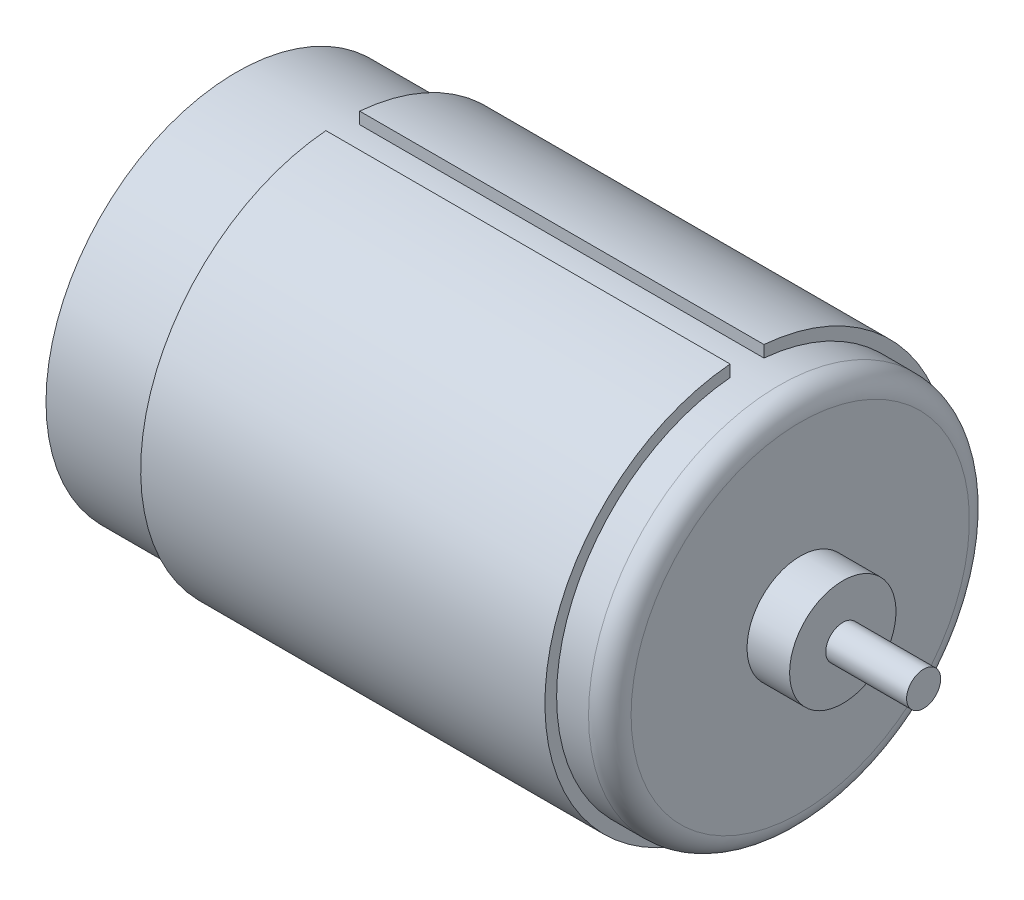
ISO-10303-21;
HEADER;
FILE_DESCRIPTION(('STEP AP214'),'2;1');
FILE_NAME('part.step','',(''),(''),'','','');
FILE_SCHEMA(('AUTOMOTIVE_DESIGN { 1 0 10303 214 1 1 1 1 }'));
ENDSEC;
DATA;
#1=APPLICATION_CONTEXT('core data for automotive mechanical design processes');
#2=APPLICATION_PROTOCOL_DEFINITION('international standard','automotive_design',2000,#1);
#3=PRODUCT_CONTEXT('',#1,'mechanical');
#4=PRODUCT('Part','Part','',(#3));
#5=PRODUCT_RELATED_PRODUCT_CATEGORY('part','',(#4));
#6=PRODUCT_DEFINITION_FORMATION('','',#4);
#7=PRODUCT_DEFINITION_CONTEXT('part definition',#1,'design');
#8=PRODUCT_DEFINITION('design','',#6,#7);
#9=PRODUCT_DEFINITION_SHAPE('','',#8);
#10=(LENGTH_UNIT() NAMED_UNIT(*) SI_UNIT(.MILLI.,.METRE.));
#11=(NAMED_UNIT(*) PLANE_ANGLE_UNIT() SI_UNIT($,.RADIAN.));
#12=(NAMED_UNIT(*) SI_UNIT($,.STERADIAN.) SOLID_ANGLE_UNIT());
#13=UNCERTAINTY_MEASURE_WITH_UNIT(LENGTH_MEASURE(1.E-05),#10,'distance_accuracy_value','');
#14=(GEOMETRIC_REPRESENTATION_CONTEXT(3) GLOBAL_UNCERTAINTY_ASSIGNED_CONTEXT((#13)) GLOBAL_UNIT_ASSIGNED_CONTEXT((#10,
#11,#12)) REPRESENTATION_CONTEXT('',''));
#15=CARTESIAN_POINT('',(0.,0.,0.));
#16=DIRECTION('',(0.,0.,1.));
#17=DIRECTION('',(1.,0.,0.));
#18=AXIS2_PLACEMENT_3D('',#15,#16,#17);
#19=CARTESIAN_POINT('',(0.,0.,0.));
#20=DIRECTION('',(1.,0.,0.));
#21=DIRECTION('',(0.,0.,-1.));
#22=AXIS2_PLACEMENT_3D('',#19,#20,#21);
#23=PLANE('',#22);
#24=CARTESIAN_POINT('',(0.,0.,0.));
#25=DIRECTION('',(-1.,0.,0.));
#26=DIRECTION('',(0.,0.,1.));
#27=AXIS2_PLACEMENT_3D('',#24,#25,#26);
#28=CIRCLE('',#27,17.9);
#29=CARTESIAN_POINT('',(0.,0.,17.9));
#30=VERTEX_POINT('',#29);
#31=EDGE_CURVE('E11',#30,#30,#28,.T.);
#32=ORIENTED_EDGE('',*,*,#31,.T.);
#33=EDGE_LOOP('',(#32));
#34=FACE_BOUND('',#33,.T.);
#35=ADVANCED_FACE('F38',(#34),#23,.F.);
#36=CARTESIAN_POINT('',(10.,17.9,0.));
#37=DIRECTION('',(1.,0.,0.));
#38=DIRECTION('',(0.,0.,-1.));
#39=AXIS2_PLACEMENT_3D('',#36,#37,#38);
#40=PLANE('',#39);
#41=CARTESIAN_POINT('',(10.,0.,0.));
#42=DIRECTION('',(-1.,0.,0.));
#43=DIRECTION('',(0.,0.,1.));
#44=AXIS2_PLACEMENT_3D('',#41,#42,#43);
#45=CIRCLE('',#44,17.9);
#46=CARTESIAN_POINT('',(10.,17.829465604723,-1.5875));
#47=VERTEX_POINT('',#46);
#48=CARTESIAN_POINT('',(10.,17.829465604723,1.5875));
#49=VERTEX_POINT('',#48);
#50=EDGE_CURVE('E46',#47,#49,#45,.T.);
#51=ORIENTED_EDGE('',*,*,#50,.F.);
#52=DIRECTION('',(0.,-1.,0.));
#53=VECTOR('',#52,1.);
#54=CARTESIAN_POINT('',(10.,18.9335639473925,-1.5875));
#55=LINE('',#54,#53);
#56=CARTESIAN_POINT('',(10.,18.9335639473925,-1.5875));
#57=VERTEX_POINT('',#56);
#58=EDGE_CURVE('E86',#57,#47,#55,.T.);
#59=ORIENTED_EDGE('',*,*,#58,.F.);
#60=CARTESIAN_POINT('',(10.,0.,0.));
#61=DIRECTION('',(-1.,0.,0.));
#62=DIRECTION('',(0.,0.,1.));
#63=AXIS2_PLACEMENT_3D('',#60,#61,#62);
#64=CIRCLE('',#63,19.);
#65=CARTESIAN_POINT('',(10.,18.9335639473925,1.5875));
#66=VERTEX_POINT('',#65);
#67=EDGE_CURVE('E94',#57,#66,#64,.T.);
#68=ORIENTED_EDGE('',*,*,#67,.T.);
#69=DIRECTION('',(0.,1.,0.));
#70=VECTOR('',#69,1.);
#71=CARTESIAN_POINT('',(10.,18.9335639473925,1.5875));
#72=LINE('',#71,#70);
#73=EDGE_CURVE('E79',#49,#66,#72,.T.);
#74=ORIENTED_EDGE('',*,*,#73,.F.);
#75=EDGE_LOOP('',(#51,#59,#68,#74));
#76=FACE_BOUND('',#75,.T.);
#77=ADVANCED_FACE('F91',(#76),#40,.F.);
#78=CARTESIAN_POINT('',(0.,0.,0.));
#79=DIRECTION('',(-1.,0.,0.));
#80=DIRECTION('',(0.,0.,1.));
#81=AXIS2_PLACEMENT_3D('',#78,#79,#80);
#82=CYLINDRICAL_SURFACE('',#81,19.);
#83=ORIENTED_EDGE('',*,*,#67,.F.);
#84=DIRECTION('',(-1.,0.,0.));
#85=VECTOR('',#84,1.);
#86=CARTESIAN_POINT('',(64.601,18.9335639473925,-1.5875));
#87=LINE('',#86,#85);
#88=CARTESIAN_POINT('',(48.,18.9335639473925,-1.5875));
#89=VERTEX_POINT('',#88);
#90=EDGE_CURVE('E132',#89,#57,#87,.T.);
#91=ORIENTED_EDGE('',*,*,#90,.F.);
#92=CARTESIAN_POINT('',(48.,0.,0.));
#93=DIRECTION('',(-1.,0.,0.));
#94=DIRECTION('',(0.,0.,1.));
#95=AXIS2_PLACEMENT_3D('',#92,#93,#94);
#96=CIRCLE('',#95,19.);
#97=CARTESIAN_POINT('',(48.,18.9335639473925,1.5875));
#98=VERTEX_POINT('',#97);
#99=EDGE_CURVE('E99',#89,#98,#96,.T.);
#100=ORIENTED_EDGE('',*,*,#99,.T.);
#101=DIRECTION('',(-1.,0.,0.));
#102=VECTOR('',#101,1.);
#103=CARTESIAN_POINT('',(64.601,18.9335639473925,1.5875));
#104=LINE('',#103,#102);
#105=EDGE_CURVE('E85',#98,#66,#104,.T.);
#106=ORIENTED_EDGE('',*,*,#105,.T.);
#107=EDGE_LOOP('',(#83,#91,#100,#106));
#108=FACE_BOUND('',#107,.T.);
#109=ADVANCED_FACE('F141',(#108),#82,.T.);
#110=CARTESIAN_POINT('',(48.,19.,0.));
#111=DIRECTION('',(-1.,0.,0.));
#112=DIRECTION('',(0.,0.,1.));
#113=AXIS2_PLACEMENT_3D('',#110,#111,#112);
#114=PLANE('',#113);
#115=ORIENTED_EDGE('',*,*,#99,.F.);
#116=DIRECTION('',(0.,1.,0.));
#117=VECTOR('',#116,1.);
#118=CARTESIAN_POINT('',(48.,18.9335639473925,-1.5875));
#119=LINE('',#118,#117);
#120=CARTESIAN_POINT('',(48.,17.829465604723,-1.5875));
#121=VERTEX_POINT('',#120);
#122=EDGE_CURVE('E95',#121,#89,#119,.T.);
#123=ORIENTED_EDGE('',*,*,#122,.F.);
#124=CARTESIAN_POINT('',(48.,0.,0.));
#125=DIRECTION('',(-1.,0.,0.));
#126=DIRECTION('',(0.,0.,1.));
#127=AXIS2_PLACEMENT_3D('',#124,#125,#126);
#128=CIRCLE('',#127,17.9);
#129=CARTESIAN_POINT('',(48.,17.829465604723,1.5875));
#130=VERTEX_POINT('',#129);
#131=EDGE_CURVE('E104',#121,#130,#128,.T.);
#132=ORIENTED_EDGE('',*,*,#131,.T.);
#133=DIRECTION('',(0.,-1.,0.));
#134=VECTOR('',#133,1.);
#135=CARTESIAN_POINT('',(48.,18.9335639473925,1.5875));
#136=LINE('',#135,#134);
#137=EDGE_CURVE('E53',#98,#130,#136,.T.);
#138=ORIENTED_EDGE('',*,*,#137,.F.);
#139=EDGE_LOOP('',(#115,#123,#132,#138));
#140=FACE_BOUND('',#139,.T.);
#141=ADVANCED_FACE('F142',(#140),#114,.F.);
#142=CARTESIAN_POINT('',(0.,0.,0.));
#143=DIRECTION('',(-1.,0.,0.));
#144=DIRECTION('',(0.,0.,1.));
#145=AXIS2_PLACEMENT_3D('',#142,#143,#144);
#146=CYLINDRICAL_SURFACE('',#145,17.9);
#147=ORIENTED_EDGE('',*,*,#131,.F.);
#148=DIRECTION('',(-1.,0.,0.));
#149=VECTOR('',#148,1.);
#150=CARTESIAN_POINT('',(64.601,17.829465604723,-1.5875));
#151=LINE('',#150,#149);
#152=EDGE_CURVE('E61',#121,#47,#151,.T.);
#153=ORIENTED_EDGE('',*,*,#152,.T.);
#154=ORIENTED_EDGE('',*,*,#50,.T.);
#155=DIRECTION('',(-1.,0.,0.));
#156=VECTOR('',#155,1.);
#157=CARTESIAN_POINT('',(64.601,17.829465604723,1.5875));
#158=LINE('',#157,#156);
#159=EDGE_CURVE('E76',#130,#49,#158,.T.);
#160=ORIENTED_EDGE('',*,*,#159,.F.);
#161=EDGE_LOOP('',(#147,#153,#154,#160));
#162=FACE_BOUND('',#161,.T.);
#163=CARTESIAN_POINT('',(51.,0.,0.));
#164=DIRECTION('',(-1.,0.,0.));
#165=DIRECTION('',(0.,0.,1.));
#166=AXIS2_PLACEMENT_3D('',#163,#164,#165);
#167=CIRCLE('',#166,17.9);
#168=CARTESIAN_POINT('',(51.,0.,17.9));
#169=VERTEX_POINT('',#168);
#170=EDGE_CURVE('E106',#169,#169,#167,.T.);
#171=ORIENTED_EDGE('',*,*,#170,.T.);
#172=EDGE_LOOP('',(#171));
#173=FACE_BOUND('',#172,.T.);
#174=ORIENTED_EDGE('',*,*,#31,.F.);
#175=EDGE_LOOP('',(#174));
#176=FACE_BOUND('',#175,.T.);
#177=ADVANCED_FACE('F97',(#162,#173,#176),#146,.T.);
#178=CARTESIAN_POINT('',(51.,0.,0.));
#179=DIRECTION('',(-1.,0.,0.));
#180=DIRECTION('',(0.,0.,1.));
#181=AXIS2_PLACEMENT_3D('',#178,#179,#180);
#182=TOROIDAL_SURFACE('',#181,15.9,2.);
#183=ORIENTED_EDGE('',*,*,#170,.F.);
#184=EDGE_LOOP('',(#183));
#185=FACE_BOUND('',#184,.T.);
#186=CARTESIAN_POINT('',(53.,0.,0.));
#187=DIRECTION('',(-1.,0.,0.));
#188=DIRECTION('',(0.,0.,1.));
#189=AXIS2_PLACEMENT_3D('',#186,#187,#188);
#190=CIRCLE('',#189,15.9);
#191=CARTESIAN_POINT('',(53.,0.,15.9));
#192=VERTEX_POINT('',#191);
#193=EDGE_CURVE('E109',#192,#192,#190,.T.);
#194=ORIENTED_EDGE('',*,*,#193,.T.);
#195=EDGE_LOOP('',(#194));
#196=FACE_BOUND('',#195,.T.);
#197=ADVANCED_FACE('F149',(#185,#196),#182,.T.);
#198=CARTESIAN_POINT('',(53.,15.9,0.));
#199=DIRECTION('',(-1.,0.,0.));
#200=DIRECTION('',(0.,0.,1.));
#201=AXIS2_PLACEMENT_3D('',#198,#199,#200);
#202=PLANE('',#201);
#203=ORIENTED_EDGE('',*,*,#193,.F.);
#204=EDGE_LOOP('',(#203));
#205=FACE_BOUND('',#204,.T.);
#206=CARTESIAN_POINT('',(53.,0.,0.));
#207=DIRECTION('',(-1.,0.,0.));
#208=DIRECTION('',(0.,0.,1.));
#209=AXIS2_PLACEMENT_3D('',#206,#207,#208);
#210=CIRCLE('',#209,5.);
#211=CARTESIAN_POINT('',(53.,0.,5.));
#212=VERTEX_POINT('',#211);
#213=EDGE_CURVE('E112',#212,#212,#210,.T.);
#214=ORIENTED_EDGE('',*,*,#213,.T.);
#215=EDGE_LOOP('',(#214));
#216=FACE_BOUND('',#215,.T.);
#217=ADVANCED_FACE('F239',(#205,#216),#202,.F.);
#218=CARTESIAN_POINT('',(0.,0.,0.));
#219=DIRECTION('',(-1.,0.,0.));
#220=DIRECTION('',(0.,0.,1.));
#221=AXIS2_PLACEMENT_3D('',#218,#219,#220);
#222=CYLINDRICAL_SURFACE('',#221,5.);
#223=ORIENTED_EDGE('',*,*,#213,.F.);
#224=EDGE_LOOP('',(#223));
#225=FACE_BOUND('',#224,.T.);
#226=CARTESIAN_POINT('',(57.,0.,0.));
#227=DIRECTION('',(-1.,0.,0.));
#228=DIRECTION('',(0.,0.,1.));
#229=AXIS2_PLACEMENT_3D('',#226,#227,#228);
#230=CIRCLE('',#229,5.);
#231=CARTESIAN_POINT('',(57.,0.,5.));
#232=VERTEX_POINT('',#231);
#233=EDGE_CURVE('E115',#232,#232,#230,.T.);
#234=ORIENTED_EDGE('',*,*,#233,.T.);
#235=EDGE_LOOP('',(#234));
#236=FACE_BOUND('',#235,.T.);
#237=ADVANCED_FACE('F248',(#225,#236),#222,.T.);
#238=CARTESIAN_POINT('',(57.,5.,0.));
#239=DIRECTION('',(-1.,0.,0.));
#240=DIRECTION('',(0.,0.,1.));
#241=AXIS2_PLACEMENT_3D('',#238,#239,#240);
#242=PLANE('',#241);
#243=ORIENTED_EDGE('',*,*,#233,.F.);
#244=EDGE_LOOP('',(#243));
#245=FACE_BOUND('',#244,.T.);
#246=CARTESIAN_POINT('',(57.,0.,0.));
#247=DIRECTION('',(-1.,0.,0.));
#248=DIRECTION('',(0.,0.,1.));
#249=AXIS2_PLACEMENT_3D('',#246,#247,#248);
#250=CIRCLE('',#249,1.6);
#251=CARTESIAN_POINT('',(57.,0.,1.6));
#252=VERTEX_POINT('',#251);
#253=EDGE_CURVE('E118',#252,#252,#250,.T.);
#254=ORIENTED_EDGE('',*,*,#253,.T.);
#255=EDGE_LOOP('',(#254));
#256=FACE_BOUND('',#255,.T.);
#257=ADVANCED_FACE('F257',(#245,#256),#242,.F.);
#258=CARTESIAN_POINT('',(0.,0.,0.));
#259=DIRECTION('',(-1.,0.,0.));
#260=DIRECTION('',(0.,0.,1.));
#261=AXIS2_PLACEMENT_3D('',#258,#259,#260);
#262=CYLINDRICAL_SURFACE('',#261,1.6);
#263=ORIENTED_EDGE('',*,*,#253,.F.);
#264=EDGE_LOOP('',(#263));
#265=FACE_BOUND('',#264,.T.);
#266=CARTESIAN_POINT('',(64.6,0.,0.));
#267=DIRECTION('',(-1.,0.,0.));
#268=DIRECTION('',(0.,0.,1.));
#269=AXIS2_PLACEMENT_3D('',#266,#267,#268);
#270=CIRCLE('',#269,1.6);
#271=CARTESIAN_POINT('',(64.6,0.,1.6));
#272=VERTEX_POINT('',#271);
#273=EDGE_CURVE('E121',#272,#272,#270,.T.);
#274=ORIENTED_EDGE('',*,*,#273,.T.);
#275=EDGE_LOOP('',(#274));
#276=FACE_BOUND('',#275,.T.);
#277=ADVANCED_FACE('F266',(#265,#276),#262,.T.);
#278=CARTESIAN_POINT('',(64.6,1.6,0.));
#279=DIRECTION('',(-1.,0.,0.));
#280=DIRECTION('',(0.,0.,1.));
#281=AXIS2_PLACEMENT_3D('',#278,#279,#280);
#282=PLANE('',#281);
#283=ORIENTED_EDGE('',*,*,#273,.F.);
#284=EDGE_LOOP('',(#283));
#285=FACE_BOUND('',#284,.T.);
#286=ADVANCED_FACE('F188',(#285),#282,.F.);
#287=CARTESIAN_POINT('',(64.601,18.9335639473925,-1.5875));
#288=DIRECTION('',(0.,0.,-1.));
#289=DIRECTION('',(0.,1.,0.));
#290=AXIS2_PLACEMENT_3D('',#287,#288,#289);
#291=PLANE('',#290);
#292=ORIENTED_EDGE('',*,*,#122,.T.);
#293=ORIENTED_EDGE('',*,*,#90,.T.);
#294=ORIENTED_EDGE('',*,*,#58,.T.);
#295=ORIENTED_EDGE('',*,*,#152,.F.);
#296=EDGE_LOOP('',(#292,#293,#294,#295));
#297=FACE_BOUND('',#296,.T.);
#298=ADVANCED_FACE('F137',(#297),#291,.F.);
#299=CARTESIAN_POINT('',(64.601,18.9335639473925,1.5875));
#300=DIRECTION('',(0.,0.,1.));
#301=DIRECTION('',(0.,-1.,0.));
#302=AXIS2_PLACEMENT_3D('',#299,#300,#301);
#303=PLANE('',#302);
#304=ORIENTED_EDGE('',*,*,#137,.T.);
#305=ORIENTED_EDGE('',*,*,#159,.T.);
#306=ORIENTED_EDGE('',*,*,#73,.T.);
#307=ORIENTED_EDGE('',*,*,#105,.F.);
#308=EDGE_LOOP('',(#304,#305,#306,#307));
#309=FACE_BOUND('',#308,.T.);
#310=ADVANCED_FACE('F78',(#309),#303,.F.);
#311=CLOSED_SHELL('',(#35,#77,#109,#141,#177,#197,#217,#237,#257,#277,#286,#298,#310));
#312=CARTESIAN_POINT('',(49.6754757200503,14.9016540324851,0.));
#313=DIRECTION('',(1.,0.,0.));
#314=DIRECTION('',(0.,0.,-1.));
#315=AXIS2_PLACEMENT_3D('',#312,#313,#314);
#316=PLANE('',#315);
#317=CARTESIAN_POINT('',(49.6754757200503,0.,0.));
#318=DIRECTION('',(-1.,0.,0.));
#319=DIRECTION('',(0.,0.,1.));
#320=AXIS2_PLACEMENT_3D('',#317,#318,#319);
#321=CIRCLE('',#320,14.9016540324851);
#322=CARTESIAN_POINT('',(49.6754757200503,0.,14.9016540324851));
#323=VERTEX_POINT('',#322);
#324=EDGE_CURVE('E124',#323,#323,#321,.T.);
#325=ORIENTED_EDGE('',*,*,#324,.T.);
#326=EDGE_LOOP('',(#325));
#327=FACE_BOUND('',#326,.T.);
#328=ADVANCED_FACE('F202',(#327),#316,.F.);
#329=CARTESIAN_POINT('',(0.,0.,0.));
#330=DIRECTION('',(-1.,0.,0.));
#331=DIRECTION('',(0.,0.,1.));
#332=AXIS2_PLACEMENT_3D('',#329,#330,#331);
#333=CYLINDRICAL_SURFACE('',#332,14.9016540324851);
#334=ORIENTED_EDGE('',*,*,#324,.F.);
#335=EDGE_LOOP('',(#334));
#336=FACE_BOUND('',#335,.T.);
#337=CARTESIAN_POINT('',(4.30178840682061,0.,0.));
#338=DIRECTION('',(-1.,0.,0.));
#339=DIRECTION('',(0.,0.,1.));
#340=AXIS2_PLACEMENT_3D('',#337,#338,#339);
#341=CIRCLE('',#340,14.9016540324851);
#342=CARTESIAN_POINT('',(4.30178840682061,0.,14.9016540324851));
#343=VERTEX_POINT('',#342);
#344=EDGE_CURVE('E127',#343,#343,#341,.T.);
#345=ORIENTED_EDGE('',*,*,#344,.T.);
#346=EDGE_LOOP('',(#345));
#347=FACE_BOUND('',#346,.T.);
#348=ADVANCED_FACE('F206',(#336,#347),#333,.F.);
#349=CARTESIAN_POINT('',(4.30178840682061,14.9016540324851,0.));
#350=DIRECTION('',(-1.,0.,0.));
#351=DIRECTION('',(0.,0.,1.));
#352=AXIS2_PLACEMENT_3D('',#349,#350,#351);
#353=PLANE('',#352);
#354=ORIENTED_EDGE('',*,*,#344,.F.);
#355=EDGE_LOOP('',(#354));
#356=FACE_BOUND('',#355,.T.);
#357=ADVANCED_FACE('F216',(#356),#353,.F.);
#358=CLOSED_SHELL('',(#328,#348,#357));
#359=ORIENTED_CLOSED_SHELL('',*,#358,.T.);
#360=BREP_WITH_VOIDS('B2',#311,(#359));
#361=ADVANCED_BREP_SHAPE_REPRESENTATION('',(#18,#360),#14);
#362=SHAPE_DEFINITION_REPRESENTATION(#9,#361);
ENDSEC;
END-ISO-10303-21;
